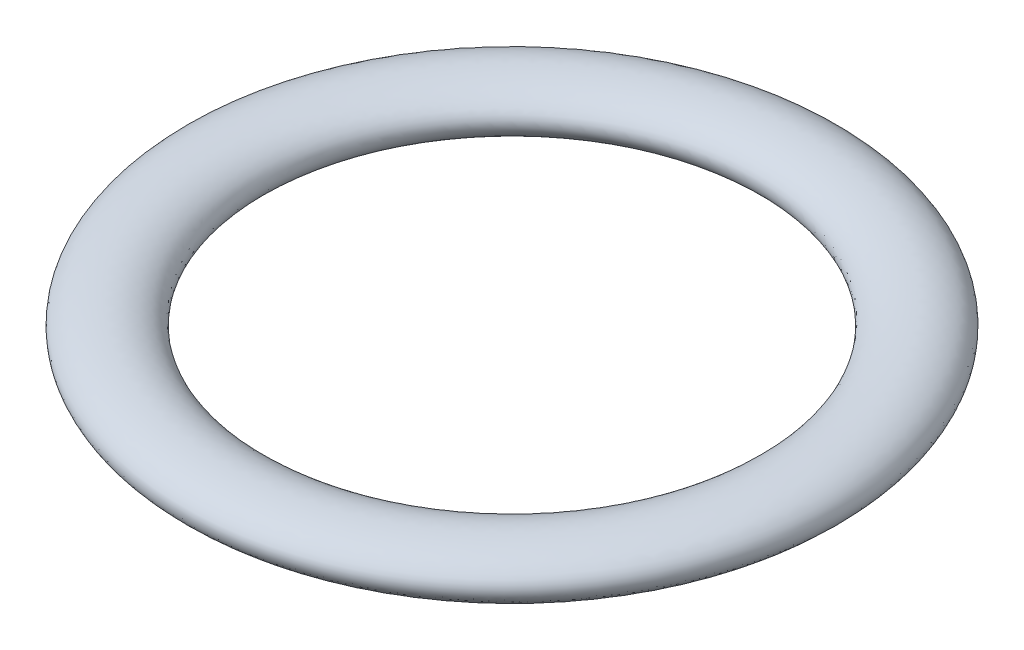
ISO-10303-21;
HEADER;
FILE_DESCRIPTION(('STEP AP214'),'2;1');
FILE_NAME('part.step','',(''),(''),'','','');
FILE_SCHEMA(('AUTOMOTIVE_DESIGN { 1 0 10303 214 1 1 1 1 }'));
ENDSEC;
DATA;
#1=APPLICATION_CONTEXT('core data for automotive mechanical design processes');
#2=APPLICATION_PROTOCOL_DEFINITION('international standard','automotive_design',2000,#1);
#3=PRODUCT_CONTEXT('',#1,'mechanical');
#4=PRODUCT('Part','Part','',(#3));
#5=PRODUCT_RELATED_PRODUCT_CATEGORY('part','',(#4));
#6=PRODUCT_DEFINITION_FORMATION('','',#4);
#7=PRODUCT_DEFINITION_CONTEXT('part definition',#1,'design');
#8=PRODUCT_DEFINITION('design','',#6,#7);
#9=PRODUCT_DEFINITION_SHAPE('','',#8);
#10=(LENGTH_UNIT() NAMED_UNIT(*) SI_UNIT(.MILLI.,.METRE.));
#11=(NAMED_UNIT(*) PLANE_ANGLE_UNIT() SI_UNIT($,.RADIAN.));
#12=(NAMED_UNIT(*) SI_UNIT($,.STERADIAN.) SOLID_ANGLE_UNIT());
#13=UNCERTAINTY_MEASURE_WITH_UNIT(LENGTH_MEASURE(1.E-05),#10,'distance_accuracy_value','');
#14=(GEOMETRIC_REPRESENTATION_CONTEXT(3) GLOBAL_UNCERTAINTY_ASSIGNED_CONTEXT((#13)) GLOBAL_UNIT_ASSIGNED_CONTEXT((#10,
#11,#12)) REPRESENTATION_CONTEXT('',''));
#15=CARTESIAN_POINT('',(0.,0.,0.));
#16=DIRECTION('',(0.,0.,1.));
#17=DIRECTION('',(1.,0.,0.));
#18=AXIS2_PLACEMENT_3D('',#15,#16,#17);
#19=CARTESIAN_POINT('',(8.675,0.,0.));
#20=DIRECTION('',(0.,0.,1.));
#21=DIRECTION('',(1.,0.,0.));
#22=AXIS2_PLACEMENT_3D('',#19,#20,#21);
#23=ELLIPSE('',#22,1.31173606280433,0.725);
#24=CARTESIAN_POINT('',(0.,-500.,0.));
#25=DIRECTION('',(0.,-1.,0.));
#26=AXIS1_PLACEMENT('',#24,#25);
#27=SURFACE_OF_REVOLUTION('',#23,#26);
#28=ADVANCED_FACE('F34',(),#27,.F.);
#29=CLOSED_SHELL('',(#28));
#30=MANIFOLD_SOLID_BREP('B2',#29);
#31=ADVANCED_BREP_SHAPE_REPRESENTATION('',(#18,#30),#14);
#32=SHAPE_DEFINITION_REPRESENTATION(#9,#31);
ENDSEC;
END-ISO-10303-21;
